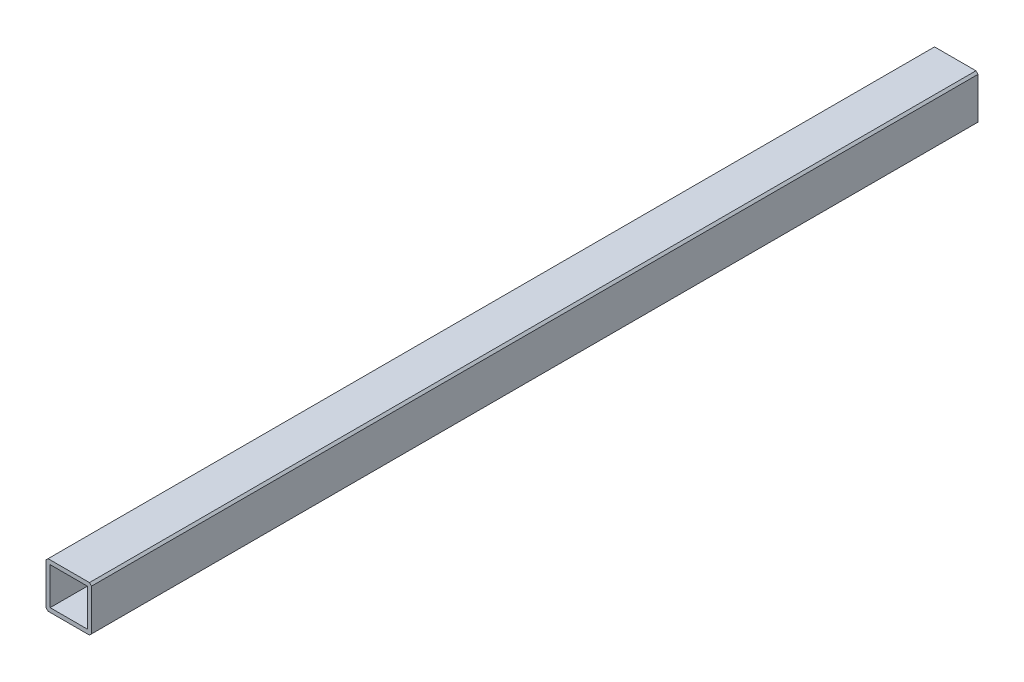
ISO-10303-21;
HEADER;
FILE_DESCRIPTION(('STEP AP214'),'2;1');
FILE_NAME('part.step','',(''),(''),'','','');
FILE_SCHEMA(('AUTOMOTIVE_DESIGN { 1 0 10303 214 1 1 1 1 }'));
ENDSEC;
DATA;
#1=APPLICATION_CONTEXT('core data for automotive mechanical design processes');
#2=APPLICATION_PROTOCOL_DEFINITION('international standard','automotive_design',2000,#1);
#3=PRODUCT_CONTEXT('',#1,'mechanical');
#4=PRODUCT('Part','Part','',(#3));
#5=PRODUCT_RELATED_PRODUCT_CATEGORY('part','',(#4));
#6=PRODUCT_DEFINITION_FORMATION('','',#4);
#7=PRODUCT_DEFINITION_CONTEXT('part definition',#1,'design');
#8=PRODUCT_DEFINITION('design','',#6,#7);
#9=PRODUCT_DEFINITION_SHAPE('','',#8);
#10=(LENGTH_UNIT() NAMED_UNIT(*) SI_UNIT(.MILLI.,.METRE.));
#11=(NAMED_UNIT(*) PLANE_ANGLE_UNIT() SI_UNIT($,.RADIAN.));
#12=(NAMED_UNIT(*) SI_UNIT($,.STERADIAN.) SOLID_ANGLE_UNIT());
#13=UNCERTAINTY_MEASURE_WITH_UNIT(LENGTH_MEASURE(1.E-05),#10,'distance_accuracy_value','');
#14=(GEOMETRIC_REPRESENTATION_CONTEXT(3) GLOBAL_UNCERTAINTY_ASSIGNED_CONTEXT((#13)) GLOBAL_UNIT_ASSIGNED_CONTEXT((#10,
#11,#12)) REPRESENTATION_CONTEXT('',''));
#15=CARTESIAN_POINT('',(0.,0.,0.));
#16=DIRECTION('',(0.,0.,1.));
#17=DIRECTION('',(1.,0.,0.));
#18=AXIS2_PLACEMENT_3D('',#15,#16,#17);
#19=CARTESIAN_POINT('',(0.,0.,0.));
#20=DIRECTION('',(0.,0.,1.));
#21=DIRECTION('',(1.,0.,0.));
#22=AXIS2_PLACEMENT_3D('',#19,#20,#21);
#23=PLANE('',#22);
#24=DIRECTION('',(0.,1.,0.));
#25=VECTOR('',#24,1.);
#26=CARTESIAN_POINT('',(11.,11.,0.));
#27=LINE('',#26,#25);
#28=CARTESIAN_POINT('',(11.,0.500000000000028,0.));
#29=VERTEX_POINT('',#28);
#30=CARTESIAN_POINT('',(11.,10.5,0.));
#31=VERTEX_POINT('',#30);
#32=EDGE_CURVE('E175',#29,#31,#27,.T.);
#33=ORIENTED_EDGE('',*,*,#32,.F.);
#34=DIRECTION('',(0.707106781186548,0.707106781186548,0.));
#35=VECTOR('',#34,1.);
#36=CARTESIAN_POINT('',(11.,0.500000000000028,0.));
#37=LINE('',#36,#35);
#38=CARTESIAN_POINT('',(10.5,0.,0.));
#39=VERTEX_POINT('',#38);
#40=EDGE_CURVE('E212',#29,#39,#37,.F.);
#41=ORIENTED_EDGE('',*,*,#40,.T.);
#42=DIRECTION('',(1.,0.,0.));
#43=VECTOR('',#42,1.);
#44=CARTESIAN_POINT('',(0.,0.,0.));
#45=LINE('',#44,#43);
#46=CARTESIAN_POINT('',(0.5,0.,0.));
#47=VERTEX_POINT('',#46);
#48=EDGE_CURVE('E198',#47,#39,#45,.T.);
#49=ORIENTED_EDGE('',*,*,#48,.F.);
#50=DIRECTION('',(0.707106781186548,-0.707106781186548,0.));
#51=VECTOR('',#50,1.);
#52=CARTESIAN_POINT('',(0.5,0.,0.));
#53=LINE('',#52,#51);
#54=CARTESIAN_POINT('',(0.,0.5,0.));
#55=VERTEX_POINT('',#54);
#56=EDGE_CURVE('E208',#47,#55,#53,.F.);
#57=ORIENTED_EDGE('',*,*,#56,.T.);
#58=DIRECTION('',(0.,-1.,0.));
#59=VECTOR('',#58,1.);
#60=CARTESIAN_POINT('',(0.,11.,0.));
#61=LINE('',#60,#59);
#62=CARTESIAN_POINT('',(0.,10.5,0.));
#63=VERTEX_POINT('',#62);
#64=EDGE_CURVE('E194',#63,#55,#61,.T.);
#65=ORIENTED_EDGE('',*,*,#64,.F.);
#66=DIRECTION('',(-0.707106781186548,-0.707106781186548,0.));
#67=VECTOR('',#66,1.);
#68=CARTESIAN_POINT('',(0.,10.5,0.));
#69=LINE('',#68,#67);
#70=CARTESIAN_POINT('',(0.5,11.,0.));
#71=VERTEX_POINT('',#70);
#72=EDGE_CURVE('E206',#63,#71,#69,.F.);
#73=ORIENTED_EDGE('',*,*,#72,.T.);
#74=DIRECTION('',(-1.,0.,0.));
#75=VECTOR('',#74,1.);
#76=CARTESIAN_POINT('',(0.,11.,0.));
#77=LINE('',#76,#75);
#78=CARTESIAN_POINT('',(10.5,11.,0.));
#79=VERTEX_POINT('',#78);
#80=EDGE_CURVE('E189',#79,#71,#77,.T.);
#81=ORIENTED_EDGE('',*,*,#80,.F.);
#82=DIRECTION('',(-0.707106781186548,0.707106781186548,0.));
#83=VECTOR('',#82,1.);
#84=CARTESIAN_POINT('',(10.5,11.,0.));
#85=LINE('',#84,#83);
#86=EDGE_CURVE('E210',#79,#31,#85,.F.);
#87=ORIENTED_EDGE('',*,*,#86,.T.);
#88=EDGE_LOOP('',(#33,#41,#49,#57,#65,#73,#81,#87));
#89=FACE_BOUND('',#88,.T.);
#90=DIRECTION('',(-1.,0.,0.));
#91=VECTOR('',#90,1.);
#92=CARTESIAN_POINT('',(0.,10.,0.));
#93=LINE('',#92,#91);
#94=CARTESIAN_POINT('',(9.99999999999999,10.,0.));
#95=VERTEX_POINT('',#94);
#96=CARTESIAN_POINT('',(1.,10.,0.));
#97=VERTEX_POINT('',#96);
#98=EDGE_CURVE('E253',#95,#97,#93,.T.);
#99=ORIENTED_EDGE('',*,*,#98,.T.);
#100=DIRECTION('',(0.,-1.,0.));
#101=VECTOR('',#100,1.);
#102=CARTESIAN_POINT('',(1.,0.,0.));
#103=LINE('',#102,#101);
#104=CARTESIAN_POINT('',(1.,1.,0.));
#105=VERTEX_POINT('',#104);
#106=EDGE_CURVE('E172',#97,#105,#103,.T.);
#107=ORIENTED_EDGE('',*,*,#106,.T.);
#108=DIRECTION('',(1.,0.,0.));
#109=VECTOR('',#108,1.);
#110=CARTESIAN_POINT('',(0.,1.,0.));
#111=LINE('',#110,#109);
#112=CARTESIAN_POINT('',(9.99999999999999,1.,0.));
#113=VERTEX_POINT('',#112);
#114=EDGE_CURVE('E250',#105,#113,#111,.T.);
#115=ORIENTED_EDGE('',*,*,#114,.T.);
#116=DIRECTION('',(0.,1.,0.));
#117=VECTOR('',#116,1.);
#118=CARTESIAN_POINT('',(9.99999999999999,0.,0.));
#119=LINE('',#118,#117);
#120=EDGE_CURVE('E190',#113,#95,#119,.T.);
#121=ORIENTED_EDGE('',*,*,#120,.T.);
#122=EDGE_LOOP('',(#99,#107,#115,#121));
#123=FACE_BOUND('',#122,.T.);
#124=ADVANCED_FACE('F59',(#89,#123),#23,.F.);
#125=CARTESIAN_POINT('',(0.,11.,229.716349186104));
#126=DIRECTION('',(0.,-1.,0.));
#127=DIRECTION('',(0.,0.,-1.));
#128=AXIS2_PLACEMENT_3D('',#125,#126,#127);
#129=PLANE('',#128);
#130=DIRECTION('',(1.,0.,0.));
#131=VECTOR('',#130,1.);
#132=CARTESIAN_POINT('',(0.,11.,214.16));
#133=LINE('',#132,#131);
#134=CARTESIAN_POINT('',(0.5,11.,214.16));
#135=VERTEX_POINT('',#134);
#136=CARTESIAN_POINT('',(10.5,11.,214.16));
#137=VERTEX_POINT('',#136);
#138=EDGE_CURVE('E187',#135,#137,#133,.T.);
#139=ORIENTED_EDGE('',*,*,#138,.T.);
#140=DIRECTION('',(0.,0.,-1.));
#141=VECTOR('',#140,1.);
#142=CARTESIAN_POINT('',(10.5,11.,229.716349186104));
#143=LINE('',#142,#141);
#144=EDGE_CURVE('E227',#137,#79,#143,.T.);
#145=ORIENTED_EDGE('',*,*,#144,.T.);
#146=ORIENTED_EDGE('',*,*,#80,.T.);
#147=DIRECTION('',(0.,0.,1.));
#148=VECTOR('',#147,1.);
#149=CARTESIAN_POINT('',(0.5,11.,229.716349186104));
#150=LINE('',#149,#148);
#151=EDGE_CURVE('E82',#71,#135,#150,.T.);
#152=ORIENTED_EDGE('',*,*,#151,.T.);
#153=EDGE_LOOP('',(#139,#145,#146,#152));
#154=FACE_BOUND('',#153,.T.);
#155=ADVANCED_FACE('F270',(#154),#129,.F.);
#156=CARTESIAN_POINT('',(0.,11.,229.716349186104));
#157=DIRECTION('',(1.,0.,0.));
#158=DIRECTION('',(0.,0.,-1.));
#159=AXIS2_PLACEMENT_3D('',#156,#157,#158);
#160=PLANE('',#159);
#161=ORIENTED_EDGE('',*,*,#64,.T.);
#162=DIRECTION('',(0.,0.,1.));
#163=VECTOR('',#162,1.);
#164=CARTESIAN_POINT('',(0.,0.5,229.716349186104));
#165=LINE('',#164,#163);
#166=CARTESIAN_POINT('',(0.,0.5,214.16));
#167=VERTEX_POINT('',#166);
#168=EDGE_CURVE('E12',#55,#167,#165,.T.);
#169=ORIENTED_EDGE('',*,*,#168,.T.);
#170=DIRECTION('',(0.,1.,0.));
#171=VECTOR('',#170,1.);
#172=CARTESIAN_POINT('',(0.,11.,214.16));
#173=LINE('',#172,#171);
#174=CARTESIAN_POINT('',(0.,10.5,214.16));
#175=VERTEX_POINT('',#174);
#176=EDGE_CURVE('E191',#167,#175,#173,.T.);
#177=ORIENTED_EDGE('',*,*,#176,.T.);
#178=DIRECTION('',(0.,0.,-1.));
#179=VECTOR('',#178,1.);
#180=CARTESIAN_POINT('',(0.,10.5,229.716349186104));
#181=LINE('',#180,#179);
#182=EDGE_CURVE('E68',#175,#63,#181,.T.);
#183=ORIENTED_EDGE('',*,*,#182,.T.);
#184=EDGE_LOOP('',(#161,#169,#177,#183));
#185=FACE_BOUND('',#184,.T.);
#186=ADVANCED_FACE('F234',(#185),#160,.F.);
#187=CARTESIAN_POINT('',(0.,0.,229.716349186104));
#188=DIRECTION('',(0.,1.,0.));
#189=DIRECTION('',(0.,0.,1.));
#190=AXIS2_PLACEMENT_3D('',#187,#188,#189);
#191=PLANE('',#190);
#192=ORIENTED_EDGE('',*,*,#48,.T.);
#193=DIRECTION('',(0.,0.,1.));
#194=VECTOR('',#193,1.);
#195=CARTESIAN_POINT('',(10.5,0.,229.716349186104));
#196=LINE('',#195,#194);
#197=CARTESIAN_POINT('',(10.5,0.,214.16));
#198=VERTEX_POINT('',#197);
#199=EDGE_CURVE('E217',#39,#198,#196,.T.);
#200=ORIENTED_EDGE('',*,*,#199,.T.);
#201=DIRECTION('',(-1.,0.,0.));
#202=VECTOR('',#201,1.);
#203=CARTESIAN_POINT('',(0.,0.,214.16));
#204=LINE('',#203,#202);
#205=CARTESIAN_POINT('',(0.5,0.,214.16));
#206=VERTEX_POINT('',#205);
#207=EDGE_CURVE('E195',#198,#206,#204,.T.);
#208=ORIENTED_EDGE('',*,*,#207,.T.);
#209=DIRECTION('',(0.,0.,-1.));
#210=VECTOR('',#209,1.);
#211=CARTESIAN_POINT('',(0.5,0.,229.716349186104));
#212=LINE('',#211,#210);
#213=EDGE_CURVE('E214',#206,#47,#212,.T.);
#214=ORIENTED_EDGE('',*,*,#213,.T.);
#215=EDGE_LOOP('',(#192,#200,#208,#214));
#216=FACE_BOUND('',#215,.T.);
#217=ADVANCED_FACE('F280',(#216),#191,.F.);
#218=CARTESIAN_POINT('',(11.,11.,229.716349186104));
#219=DIRECTION('',(-1.,0.,0.));
#220=DIRECTION('',(0.,0.,1.));
#221=AXIS2_PLACEMENT_3D('',#218,#219,#220);
#222=PLANE('',#221);
#223=DIRECTION('',(0.,-1.,0.));
#224=VECTOR('',#223,1.);
#225=CARTESIAN_POINT('',(11.,11.,214.16));
#226=LINE('',#225,#224);
#227=CARTESIAN_POINT('',(11.,10.5,214.16));
#228=VERTEX_POINT('',#227);
#229=CARTESIAN_POINT('',(11.,0.500000000000028,214.16));
#230=VERTEX_POINT('',#229);
#231=EDGE_CURVE('E180',#228,#230,#226,.T.);
#232=ORIENTED_EDGE('',*,*,#231,.T.);
#233=DIRECTION('',(0.,0.,-1.));
#234=VECTOR('',#233,1.);
#235=CARTESIAN_POINT('',(11.,0.500000000000028,229.716349186104));
#236=LINE('',#235,#234);
#237=EDGE_CURVE('E203',#230,#29,#236,.T.);
#238=ORIENTED_EDGE('',*,*,#237,.T.);
#239=ORIENTED_EDGE('',*,*,#32,.T.);
#240=DIRECTION('',(0.,0.,1.));
#241=VECTOR('',#240,1.);
#242=CARTESIAN_POINT('',(11.,10.5,229.716349186104));
#243=LINE('',#242,#241);
#244=EDGE_CURVE('E159',#31,#228,#243,.T.);
#245=ORIENTED_EDGE('',*,*,#244,.T.);
#246=EDGE_LOOP('',(#232,#238,#239,#245));
#247=FACE_BOUND('',#246,.T.);
#248=ADVANCED_FACE('F277',(#247),#222,.F.);
#249=CARTESIAN_POINT('',(0.,10.,229.716349186104));
#250=DIRECTION('',(0.,-1.,0.));
#251=DIRECTION('',(0.,0.,-1.));
#252=AXIS2_PLACEMENT_3D('',#249,#250,#251);
#253=PLANE('',#252);
#254=DIRECTION('',(1.,0.,0.));
#255=VECTOR('',#254,1.);
#256=CARTESIAN_POINT('',(0.,10.,214.16));
#257=LINE('',#256,#255);
#258=CARTESIAN_POINT('',(1.,10.,214.16));
#259=VERTEX_POINT('',#258);
#260=CARTESIAN_POINT('',(9.99999999999999,10.,214.16));
#261=VERTEX_POINT('',#260);
#262=EDGE_CURVE('E152',#259,#261,#257,.T.);
#263=ORIENTED_EDGE('',*,*,#262,.F.);
#264=DIRECTION('',(0.,0.,-1.));
#265=VECTOR('',#264,1.);
#266=CARTESIAN_POINT('',(1.,10.,229.716349186104));
#267=LINE('',#266,#265);
#268=EDGE_CURVE('E164',#259,#97,#267,.T.);
#269=ORIENTED_EDGE('',*,*,#268,.T.);
#270=ORIENTED_EDGE('',*,*,#98,.F.);
#271=DIRECTION('',(0.,0.,-1.));
#272=VECTOR('',#271,1.);
#273=CARTESIAN_POINT('',(9.99999999999999,10.,229.716349186104));
#274=LINE('',#273,#272);
#275=EDGE_CURVE('E166',#261,#95,#274,.T.);
#276=ORIENTED_EDGE('',*,*,#275,.F.);
#277=EDGE_LOOP('',(#263,#269,#270,#276));
#278=FACE_BOUND('',#277,.T.);
#279=ADVANCED_FACE('F162',(#278),#253,.T.);
#280=CARTESIAN_POINT('',(1.,0.,229.716349186104));
#281=DIRECTION('',(1.,0.,0.));
#282=DIRECTION('',(0.,0.,-1.));
#283=AXIS2_PLACEMENT_3D('',#280,#281,#282);
#284=PLANE('',#283);
#285=DIRECTION('',(0.,1.,0.));
#286=VECTOR('',#285,1.);
#287=CARTESIAN_POINT('',(1.,0.,214.16));
#288=LINE('',#287,#286);
#289=CARTESIAN_POINT('',(1.,1.,214.16));
#290=VERTEX_POINT('',#289);
#291=EDGE_CURVE('E149',#290,#259,#288,.T.);
#292=ORIENTED_EDGE('',*,*,#291,.F.);
#293=DIRECTION('',(0.,0.,-1.));
#294=VECTOR('',#293,1.);
#295=CARTESIAN_POINT('',(1.,1.,229.716349186104));
#296=LINE('',#295,#294);
#297=EDGE_CURVE('E174',#290,#105,#296,.T.);
#298=ORIENTED_EDGE('',*,*,#297,.T.);
#299=ORIENTED_EDGE('',*,*,#106,.F.);
#300=ORIENTED_EDGE('',*,*,#268,.F.);
#301=EDGE_LOOP('',(#292,#298,#299,#300));
#302=FACE_BOUND('',#301,.T.);
#303=ADVANCED_FACE('F170',(#302),#284,.T.);
#304=CARTESIAN_POINT('',(0.,1.,229.716349186104));
#305=DIRECTION('',(0.,1.,0.));
#306=DIRECTION('',(0.,0.,1.));
#307=AXIS2_PLACEMENT_3D('',#304,#305,#306);
#308=PLANE('',#307);
#309=DIRECTION('',(-1.,0.,0.));
#310=VECTOR('',#309,1.);
#311=CARTESIAN_POINT('',(0.,1.,214.16));
#312=LINE('',#311,#310);
#313=CARTESIAN_POINT('',(9.99999999999999,1.,214.16));
#314=VERTEX_POINT('',#313);
#315=EDGE_CURVE('E155',#314,#290,#312,.T.);
#316=ORIENTED_EDGE('',*,*,#315,.F.);
#317=DIRECTION('',(0.,0.,-1.));
#318=VECTOR('',#317,1.);
#319=CARTESIAN_POINT('',(9.99999999999999,1.,229.716349186104));
#320=LINE('',#319,#318);
#321=EDGE_CURVE('E177',#314,#113,#320,.T.);
#322=ORIENTED_EDGE('',*,*,#321,.T.);
#323=ORIENTED_EDGE('',*,*,#114,.F.);
#324=ORIENTED_EDGE('',*,*,#297,.F.);
#325=EDGE_LOOP('',(#316,#322,#323,#324));
#326=FACE_BOUND('',#325,.T.);
#327=ADVANCED_FACE('F260',(#326),#308,.T.);
#328=CARTESIAN_POINT('',(9.99999999999999,0.,229.716349186104));
#329=DIRECTION('',(-1.,0.,0.));
#330=DIRECTION('',(0.,0.,1.));
#331=AXIS2_PLACEMENT_3D('',#328,#329,#330);
#332=PLANE('',#331);
#333=DIRECTION('',(0.,-1.,0.));
#334=VECTOR('',#333,1.);
#335=CARTESIAN_POINT('',(9.99999999999999,0.,214.16));
#336=LINE('',#335,#334);
#337=EDGE_CURVE('E168',#261,#314,#336,.T.);
#338=ORIENTED_EDGE('',*,*,#337,.F.);
#339=ORIENTED_EDGE('',*,*,#275,.T.);
#340=ORIENTED_EDGE('',*,*,#120,.F.);
#341=ORIENTED_EDGE('',*,*,#321,.F.);
#342=EDGE_LOOP('',(#338,#339,#340,#341));
#343=FACE_BOUND('',#342,.T.);
#344=ADVANCED_FACE('F258',(#343),#332,.T.);
#345=CARTESIAN_POINT('',(-61.765257736591,5.3922486298544,214.16));
#346=DIRECTION('',(0.,0.,-1.));
#347=DIRECTION('',(-0.195090322016127,-0.980785280403231,0.));
#348=AXIS2_PLACEMENT_3D('',#345,#346,#347);
#349=PLANE('',#348);
#350=ORIENTED_EDGE('',*,*,#262,.T.);
#351=ORIENTED_EDGE('',*,*,#337,.T.);
#352=ORIENTED_EDGE('',*,*,#315,.T.);
#353=ORIENTED_EDGE('',*,*,#291,.T.);
#354=EDGE_LOOP('',(#350,#351,#352,#353));
#355=FACE_BOUND('',#354,.T.);
#356=ORIENTED_EDGE('',*,*,#207,.F.);
#357=DIRECTION('',(-0.707106781186548,-0.707106781186548,0.));
#358=VECTOR('',#357,1.);
#359=CARTESIAN_POINT('',(11.,0.500000000000028,214.16));
#360=LINE('',#359,#358);
#361=EDGE_CURVE('E224',#198,#230,#360,.F.);
#362=ORIENTED_EDGE('',*,*,#361,.T.);
#363=ORIENTED_EDGE('',*,*,#231,.F.);
#364=DIRECTION('',(0.707106781186548,-0.707106781186548,0.));
#365=VECTOR('',#364,1.);
#366=CARTESIAN_POINT('',(10.5,11.,214.16));
#367=LINE('',#366,#365);
#368=EDGE_CURVE('E75',#228,#137,#367,.F.);
#369=ORIENTED_EDGE('',*,*,#368,.T.);
#370=ORIENTED_EDGE('',*,*,#138,.F.);
#371=DIRECTION('',(0.707106781186548,0.707106781186548,0.));
#372=VECTOR('',#371,1.);
#373=CARTESIAN_POINT('',(0.,10.5,214.16));
#374=LINE('',#373,#372);
#375=EDGE_CURVE('E219',#135,#175,#374,.F.);
#376=ORIENTED_EDGE('',*,*,#375,.T.);
#377=ORIENTED_EDGE('',*,*,#176,.F.);
#378=DIRECTION('',(-0.707106781186548,0.707106781186548,0.));
#379=VECTOR('',#378,1.);
#380=CARTESIAN_POINT('',(0.500000000000002,0.,214.16));
#381=LINE('',#380,#379);
#382=EDGE_CURVE('E221',#167,#206,#381,.F.);
#383=ORIENTED_EDGE('',*,*,#382,.T.);
#384=EDGE_LOOP('',(#356,#362,#363,#369,#370,#376,#377,#383));
#385=FACE_BOUND('',#384,.T.);
#386=ADVANCED_FACE('F151',(#355,#385),#349,.F.);
#387=CARTESIAN_POINT('',(11.,0.500000000000028,229.716349186104));
#388=DIRECTION('',(-0.707106781186548,0.707106781186548,0.));
#389=DIRECTION('',(0.,0.,-1.));
#390=AXIS2_PLACEMENT_3D('',#387,#388,#389);
#391=PLANE('',#390);
#392=ORIENTED_EDGE('',*,*,#361,.F.);
#393=ORIENTED_EDGE('',*,*,#199,.F.);
#394=ORIENTED_EDGE('',*,*,#40,.F.);
#395=ORIENTED_EDGE('',*,*,#237,.F.);
#396=EDGE_LOOP('',(#392,#393,#394,#395));
#397=FACE_BOUND('',#396,.T.);
#398=ADVANCED_FACE('F343',(#397),#391,.F.);
#399=CARTESIAN_POINT('',(10.5,11.,229.716349186104));
#400=DIRECTION('',(-0.707106781186547,-0.707106781186547,0.));
#401=DIRECTION('',(0.,0.,-1.));
#402=AXIS2_PLACEMENT_3D('',#399,#400,#401);
#403=PLANE('',#402);
#404=ORIENTED_EDGE('',*,*,#368,.F.);
#405=ORIENTED_EDGE('',*,*,#244,.F.);
#406=ORIENTED_EDGE('',*,*,#86,.F.);
#407=ORIENTED_EDGE('',*,*,#144,.F.);
#408=EDGE_LOOP('',(#404,#405,#406,#407));
#409=FACE_BOUND('',#408,.T.);
#410=ADVANCED_FACE('F349',(#409),#403,.F.);
#411=CARTESIAN_POINT('',(0.5,0.,229.716349186104));
#412=DIRECTION('',(0.707106781186547,0.707106781186547,0.));
#413=DIRECTION('',(0.,0.,-1.));
#414=AXIS2_PLACEMENT_3D('',#411,#412,#413);
#415=PLANE('',#414);
#416=ORIENTED_EDGE('',*,*,#382,.F.);
#417=ORIENTED_EDGE('',*,*,#168,.F.);
#418=ORIENTED_EDGE('',*,*,#56,.F.);
#419=ORIENTED_EDGE('',*,*,#213,.F.);
#420=EDGE_LOOP('',(#416,#417,#418,#419));
#421=FACE_BOUND('',#420,.T.);
#422=ADVANCED_FACE('F357',(#421),#415,.F.);
#423=CARTESIAN_POINT('',(0.,10.5,229.716349186104));
#424=DIRECTION('',(0.707106781186547,-0.707106781186547,0.));
#425=DIRECTION('',(0.,0.,-1.));
#426=AXIS2_PLACEMENT_3D('',#423,#424,#425);
#427=PLANE('',#426);
#428=ORIENTED_EDGE('',*,*,#375,.F.);
#429=ORIENTED_EDGE('',*,*,#151,.F.);
#430=ORIENTED_EDGE('',*,*,#72,.F.);
#431=ORIENTED_EDGE('',*,*,#182,.F.);
#432=EDGE_LOOP('',(#428,#429,#430,#431));
#433=FACE_BOUND('',#432,.T.);
#434=ADVANCED_FACE('F62',(#433),#427,.F.);
#435=CLOSED_SHELL('',(#124,#155,#186,#217,#248,#279,#303,#327,#344,#386,#398,#410,#422,#434));
#436=MANIFOLD_SOLID_BREP('B2',#435);
#437=ADVANCED_BREP_SHAPE_REPRESENTATION('',(#18,#436),#14);
#438=SHAPE_DEFINITION_REPRESENTATION(#9,#437);
ENDSEC;
END-ISO-10303-21;
